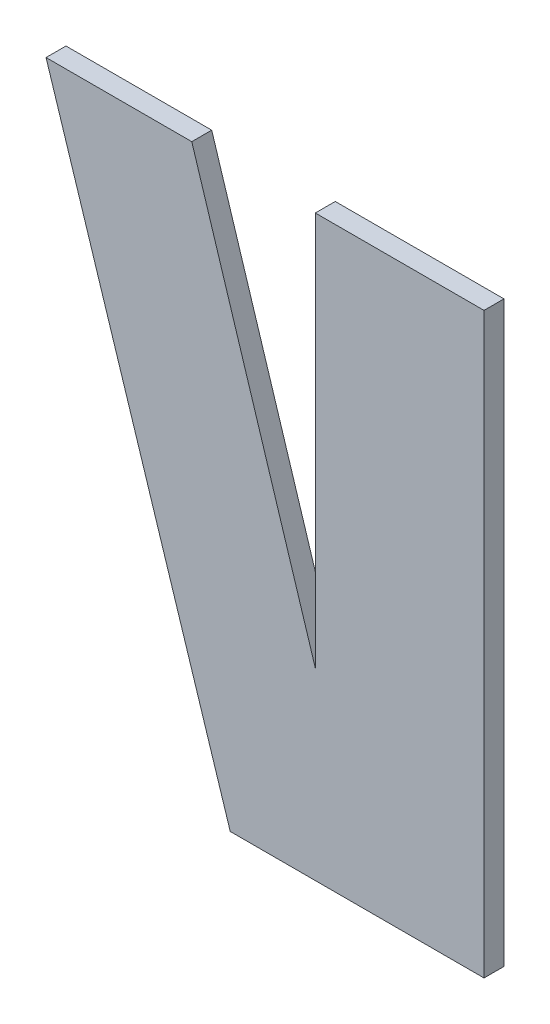
ISO-10303-21;
HEADER;
FILE_DESCRIPTION(('STEP AP214'),'2;1');
FILE_NAME('part.step','',(''),(''),'','','');
FILE_SCHEMA(('AUTOMOTIVE_DESIGN { 1 0 10303 214 1 1 1 1 }'));
ENDSEC;
DATA;
#1=APPLICATION_CONTEXT('core data for automotive mechanical design processes');
#2=APPLICATION_PROTOCOL_DEFINITION('international standard','automotive_design',2000,#1);
#3=PRODUCT_CONTEXT('',#1,'mechanical');
#4=PRODUCT('Part','Part','',(#3));
#5=PRODUCT_RELATED_PRODUCT_CATEGORY('part','',(#4));
#6=PRODUCT_DEFINITION_FORMATION('','',#4);
#7=PRODUCT_DEFINITION_CONTEXT('part definition',#1,'design');
#8=PRODUCT_DEFINITION('design','',#6,#7);
#9=PRODUCT_DEFINITION_SHAPE('','',#8);
#10=(LENGTH_UNIT() NAMED_UNIT(*) SI_UNIT(.MILLI.,.METRE.));
#11=(NAMED_UNIT(*) PLANE_ANGLE_UNIT() SI_UNIT($,.RADIAN.));
#12=(NAMED_UNIT(*) SI_UNIT($,.STERADIAN.) SOLID_ANGLE_UNIT());
#13=UNCERTAINTY_MEASURE_WITH_UNIT(LENGTH_MEASURE(1.E-05),#10,'distance_accuracy_value','');
#14=(GEOMETRIC_REPRESENTATION_CONTEXT(3) GLOBAL_UNCERTAINTY_ASSIGNED_CONTEXT((#13)) GLOBAL_UNIT_ASSIGNED_CONTEXT((#10,
#11,#12)) REPRESENTATION_CONTEXT('',''));
#15=CARTESIAN_POINT('',(0.,0.,0.));
#16=DIRECTION('',(0.,0.,1.));
#17=DIRECTION('',(1.,0.,0.));
#18=AXIS2_PLACEMENT_3D('',#15,#16,#17);
#19=CARTESIAN_POINT('',(14.3076923076902,-15.,0.5));
#20=DIRECTION('',(0.,1.,0.));
#21=DIRECTION('',(0.,0.,1.));
#22=AXIS2_PLACEMENT_3D('',#19,#20,#21);
#23=PLANE('',#22);
#24=DIRECTION('',(-1.,0.,0.));
#25=VECTOR('',#24,1.);
#26=CARTESIAN_POINT('',(14.3076923076902,-15.,1.));
#27=LINE('',#26,#25);
#28=CARTESIAN_POINT('',(14.3076923076902,-15.,1.));
#29=VERTEX_POINT('',#28);
#30=CARTESIAN_POINT('',(7.94350961538255,-15.,1.));
#31=VERTEX_POINT('',#30);
#32=EDGE_CURVE('E130',#29,#31,#27,.T.);
#33=ORIENTED_EDGE('',*,*,#32,.T.);
#34=DIRECTION('',(0.,0.,1.));
#35=VECTOR('',#34,1.);
#36=CARTESIAN_POINT('',(7.94350961538255,-15.,0.5));
#37=LINE('',#36,#35);
#38=CARTESIAN_POINT('',(7.94350961538255,-15.,0.5));
#39=VERTEX_POINT('',#38);
#40=EDGE_CURVE('E133',#39,#31,#37,.T.);
#41=ORIENTED_EDGE('',*,*,#40,.F.);
#42=DIRECTION('',(-1.,0.,0.));
#43=VECTOR('',#42,1.);
#44=CARTESIAN_POINT('',(14.3076923076902,-15.,0.5));
#45=LINE('',#44,#43);
#46=CARTESIAN_POINT('',(14.3076923076902,-15.,0.5));
#47=VERTEX_POINT('',#46);
#48=EDGE_CURVE('E116',#47,#39,#45,.T.);
#49=ORIENTED_EDGE('',*,*,#48,.F.);
#50=DIRECTION('',(0.,0.,1.));
#51=VECTOR('',#50,1.);
#52=CARTESIAN_POINT('',(14.3076923076902,-15.,0.5));
#53=LINE('',#52,#51);
#54=EDGE_CURVE('E118',#47,#29,#53,.T.);
#55=ORIENTED_EDGE('',*,*,#54,.T.);
#56=EDGE_LOOP('',(#33,#41,#49,#55));
#57=FACE_BOUND('',#56,.T.);
#58=ADVANCED_FACE('F39',(#57),#23,.F.);
#59=CARTESIAN_POINT('',(0.551180523599077,8.25129500228357,0.5));
#60=DIRECTION('',(0.,0.,-1.));
#61=DIRECTION('',(-1.,0.,0.));
#62=AXIS2_PLACEMENT_3D('',#59,#60,#61);
#63=PLANE('',#62);
#64=DIRECTION('',(-1.,0.,0.));
#65=VECTOR('',#64,1.);
#66=CARTESIAN_POINT('',(0.551180523599077,-0.5,0.499999999999894));
#67=LINE('',#66,#65);
#68=CARTESIAN_POINT('',(14.3076923076902,-0.5,0.5));
#69=VERTEX_POINT('',#68);
#70=CARTESIAN_POINT('',(10.076923076921,-0.5,0.500000000000267));
#71=VERTEX_POINT('',#70);
#72=EDGE_CURVE('E11',#69,#71,#67,.T.);
#73=ORIENTED_EDGE('',*,*,#72,.F.);
#74=DIRECTION('',(0.,-1.,0.));
#75=VECTOR('',#74,1.);
#76=CARTESIAN_POINT('',(14.3076923076902,15.,0.5));
#77=LINE('',#76,#75);
#78=EDGE_CURVE('E120',#69,#47,#77,.T.);
#79=ORIENTED_EDGE('',*,*,#78,.T.);
#80=ORIENTED_EDGE('',*,*,#48,.T.);
#81=DIRECTION('',(-0.303551674204234,0.95281497736329,0.));
#82=VECTOR('',#81,1.);
#83=CARTESIAN_POINT('',(7.94350961538255,-15.,0.5));
#84=LINE('',#83,#82);
#85=CARTESIAN_POINT('',(3.32404058883388,-0.499999999999999,0.500000000000001));
#86=VERTEX_POINT('',#85);
#87=EDGE_CURVE('E125',#39,#86,#84,.T.);
#88=ORIENTED_EDGE('',*,*,#87,.T.);
#89=CARTESIAN_POINT('',(6.97862033799327,-0.5,0.500000000000073));
#90=VERTEX_POINT('',#89);
#91=EDGE_CURVE('E48',#90,#86,#67,.T.);
#92=ORIENTED_EDGE('',*,*,#91,.F.);
#93=DIRECTION('',(0.299098108650077,-0.954222364756741,0.));
#94=VECTOR('',#93,1.);
#95=CARTESIAN_POINT('',(2.12019230769024,15.,0.5));
#96=LINE('',#95,#94);
#97=CARTESIAN_POINT('',(10.076923076921,-10.3846153846154,0.5));
#98=VERTEX_POINT('',#97);
#99=EDGE_CURVE('E114',#90,#98,#96,.T.);
#100=ORIENTED_EDGE('',*,*,#99,.T.);
#101=DIRECTION('',(0.,1.,0.));
#102=VECTOR('',#101,1.);
#103=CARTESIAN_POINT('',(10.076923076921,-10.3846153846154,0.5));
#104=LINE('',#103,#102);
#105=EDGE_CURVE('E115',#98,#71,#104,.T.);
#106=ORIENTED_EDGE('',*,*,#105,.T.);
#107=EDGE_LOOP('',(#73,#79,#80,#88,#92,#100,#106));
#108=FACE_BOUND('',#107,.T.);
#109=ADVANCED_FACE('F162',(#108),#63,.T.);
#110=CARTESIAN_POINT('',(10.076923076921,-10.3846153846154,0.5));
#111=DIRECTION('',(1.,0.,0.));
#112=DIRECTION('',(0.,0.,-1.));
#113=AXIS2_PLACEMENT_3D('',#110,#111,#112);
#114=PLANE('',#113);
#115=DIRECTION('',(0.,1.,0.));
#116=VECTOR('',#115,1.);
#117=CARTESIAN_POINT('',(10.076923076921,-10.3846153846154,1.));
#118=LINE('',#117,#116);
#119=CARTESIAN_POINT('',(10.076923076921,-10.3846153846154,1.));
#120=VERTEX_POINT('',#119);
#121=CARTESIAN_POINT('',(10.076923076921,-0.5,1.));
#122=VERTEX_POINT('',#121);
#123=EDGE_CURVE('E98',#120,#122,#118,.T.);
#124=ORIENTED_EDGE('',*,*,#123,.T.);
#125=DIRECTION('',(0.,0.,-1.));
#126=VECTOR('',#125,1.);
#127=CARTESIAN_POINT('',(10.076923076921,-0.5,0.5));
#128=LINE('',#127,#126);
#129=EDGE_CURVE('E89',#122,#71,#128,.T.);
#130=ORIENTED_EDGE('',*,*,#129,.T.);
#131=ORIENTED_EDGE('',*,*,#105,.F.);
#132=DIRECTION('',(0.,0.,1.));
#133=VECTOR('',#132,1.);
#134=CARTESIAN_POINT('',(10.076923076921,-10.3846153846154,0.5));
#135=LINE('',#134,#133);
#136=EDGE_CURVE('E97',#98,#120,#135,.T.);
#137=ORIENTED_EDGE('',*,*,#136,.T.);
#138=EDGE_LOOP('',(#124,#130,#131,#137));
#139=FACE_BOUND('',#138,.T.);
#140=ADVANCED_FACE('F108',(#139),#114,.F.);
#141=CARTESIAN_POINT('',(2.12019230769024,15.,0.5));
#142=DIRECTION('',(-0.954222364756741,-0.299098108650077,0.));
#143=DIRECTION('',(0.299098108650077,-0.954222364756741,0.));
#144=AXIS2_PLACEMENT_3D('',#141,#142,#143);
#145=PLANE('',#144);
#146=ORIENTED_EDGE('',*,*,#99,.F.);
#147=DIRECTION('',(0.,0.,1.));
#148=VECTOR('',#147,1.);
#149=CARTESIAN_POINT('',(6.97862033799327,-0.499999999999999,0.5));
#150=LINE('',#149,#148);
#151=CARTESIAN_POINT('',(6.97862033799327,-0.5,1.));
#152=VERTEX_POINT('',#151);
#153=EDGE_CURVE('E140',#90,#152,#150,.T.);
#154=ORIENTED_EDGE('',*,*,#153,.T.);
#155=DIRECTION('',(0.299098108650077,-0.954222364756741,0.));
#156=VECTOR('',#155,1.);
#157=CARTESIAN_POINT('',(2.12019230769024,15.,1.));
#158=LINE('',#157,#156);
#159=EDGE_CURVE('E143',#152,#120,#158,.T.);
#160=ORIENTED_EDGE('',*,*,#159,.T.);
#161=ORIENTED_EDGE('',*,*,#136,.F.);
#162=EDGE_LOOP('',(#146,#154,#160,#161));
#163=FACE_BOUND('',#162,.T.);
#164=ADVANCED_FACE('F165',(#163),#145,.F.);
#165=CARTESIAN_POINT('',(7.94350961538255,-15.,0.5));
#166=DIRECTION('',(0.95281497736329,0.303551674204234,0.));
#167=DIRECTION('',(-0.303551674204234,0.95281497736329,0.));
#168=AXIS2_PLACEMENT_3D('',#165,#166,#167);
#169=PLANE('',#168);
#170=DIRECTION('',(-0.303551674204234,0.95281497736329,0.));
#171=VECTOR('',#170,1.);
#172=CARTESIAN_POINT('',(7.94350961538255,-15.,1.));
#173=LINE('',#172,#171);
#174=CARTESIAN_POINT('',(3.32404058883388,-0.5,1.));
#175=VERTEX_POINT('',#174);
#176=EDGE_CURVE('E145',#31,#175,#173,.T.);
#177=ORIENTED_EDGE('',*,*,#176,.T.);
#178=DIRECTION('',(0.,0.,-1.));
#179=VECTOR('',#178,1.);
#180=CARTESIAN_POINT('',(3.32404058883388,-0.5,0.5));
#181=LINE('',#180,#179);
#182=EDGE_CURVE('E136',#175,#86,#181,.T.);
#183=ORIENTED_EDGE('',*,*,#182,.T.);
#184=ORIENTED_EDGE('',*,*,#87,.F.);
#185=ORIENTED_EDGE('',*,*,#40,.T.);
#186=EDGE_LOOP('',(#177,#183,#184,#185));
#187=FACE_BOUND('',#186,.T.);
#188=ADVANCED_FACE('F154',(#187),#169,.F.);
#189=CARTESIAN_POINT('',(14.3076923076902,15.,0.5));
#190=DIRECTION('',(-1.,0.,0.));
#191=DIRECTION('',(0.,0.,1.));
#192=AXIS2_PLACEMENT_3D('',#189,#190,#191);
#193=PLANE('',#192);
#194=ORIENTED_EDGE('',*,*,#78,.F.);
#195=DIRECTION('',(0.,0.,1.));
#196=VECTOR('',#195,1.);
#197=CARTESIAN_POINT('',(14.3076923076902,-0.5,0.5));
#198=LINE('',#197,#196);
#199=CARTESIAN_POINT('',(14.3076923076902,-0.5,1.));
#200=VERTEX_POINT('',#199);
#201=EDGE_CURVE('E53',#69,#200,#198,.T.);
#202=ORIENTED_EDGE('',*,*,#201,.T.);
#203=DIRECTION('',(0.,-1.,0.));
#204=VECTOR('',#203,1.);
#205=CARTESIAN_POINT('',(14.3076923076902,15.,1.));
#206=LINE('',#205,#204);
#207=EDGE_CURVE('E107',#200,#29,#206,.T.);
#208=ORIENTED_EDGE('',*,*,#207,.T.);
#209=ORIENTED_EDGE('',*,*,#54,.F.);
#210=EDGE_LOOP('',(#194,#202,#208,#209));
#211=FACE_BOUND('',#210,.T.);
#212=ADVANCED_FACE('F163',(#211),#193,.F.);
#213=CARTESIAN_POINT('',(0.551180523599077,8.25129500228357,1.));
#214=DIRECTION('',(0.,0.,-1.));
#215=DIRECTION('',(-1.,0.,0.));
#216=AXIS2_PLACEMENT_3D('',#213,#214,#215);
#217=PLANE('',#216);
#218=ORIENTED_EDGE('',*,*,#207,.F.);
#219=DIRECTION('',(-1.,0.,0.));
#220=VECTOR('',#219,1.);
#221=CARTESIAN_POINT('',(-17.,-0.5,1.));
#222=LINE('',#221,#220);
#223=EDGE_CURVE('E93',#200,#122,#222,.T.);
#224=ORIENTED_EDGE('',*,*,#223,.T.);
#225=ORIENTED_EDGE('',*,*,#123,.F.);
#226=ORIENTED_EDGE('',*,*,#159,.F.);
#227=EDGE_CURVE('E109',#152,#175,#222,.T.);
#228=ORIENTED_EDGE('',*,*,#227,.T.);
#229=ORIENTED_EDGE('',*,*,#176,.F.);
#230=ORIENTED_EDGE('',*,*,#32,.F.);
#231=EDGE_LOOP('',(#218,#224,#225,#226,#228,#229,#230));
#232=FACE_BOUND('',#231,.T.);
#233=ADVANCED_FACE('F41',(#232),#217,.F.);
#234=CARTESIAN_POINT('',(-17.,-0.5,1.));
#235=DIRECTION('',(0.,-1.,0.));
#236=DIRECTION('',(0.,0.,-1.));
#237=AXIS2_PLACEMENT_3D('',#234,#235,#236);
#238=PLANE('',#237);
#239=ORIENTED_EDGE('',*,*,#227,.F.);
#240=ORIENTED_EDGE('',*,*,#153,.F.);
#241=ORIENTED_EDGE('',*,*,#91,.T.);
#242=ORIENTED_EDGE('',*,*,#182,.F.);
#243=EDGE_LOOP('',(#239,#240,#241,#242));
#244=FACE_BOUND('',#243,.T.);
#245=ADVANCED_FACE('F159',(#244),#238,.F.);
#246=ORIENTED_EDGE('',*,*,#72,.T.);
#247=ORIENTED_EDGE('',*,*,#129,.F.);
#248=ORIENTED_EDGE('',*,*,#223,.F.);
#249=ORIENTED_EDGE('',*,*,#201,.F.);
#250=EDGE_LOOP('',(#246,#247,#248,#249));
#251=FACE_BOUND('',#250,.T.);
#252=ADVANCED_FACE('F95',(#251),#238,.F.);
#253=CLOSED_SHELL('',(#58,#109,#140,#164,#188,#212,#233,#245,#252));
#254=MANIFOLD_SOLID_BREP('B2',#253);
#255=ADVANCED_BREP_SHAPE_REPRESENTATION('',(#18,#254),#14);
#256=SHAPE_DEFINITION_REPRESENTATION(#9,#255);
ENDSEC;
END-ISO-10303-21;
